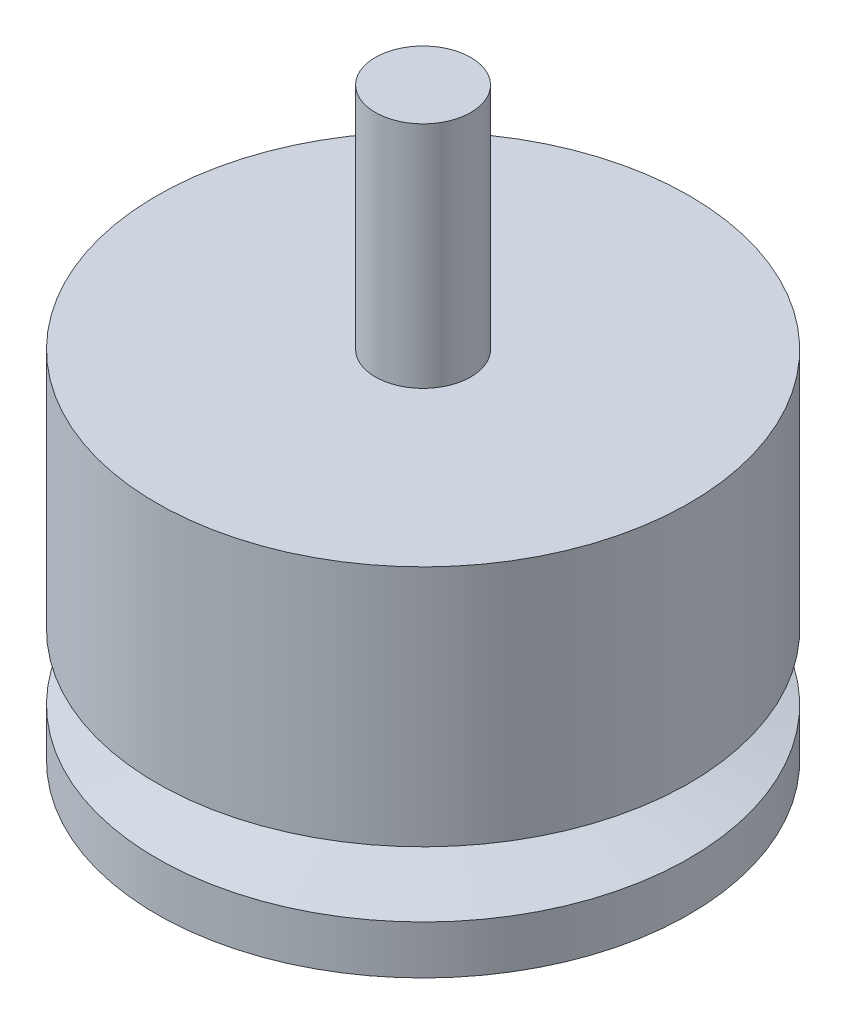
ISO-10303-21;
HEADER;
FILE_DESCRIPTION(('STEP AP214'),'2;1');
FILE_NAME('part.step','',(''),(''),'','','');
FILE_SCHEMA(('AUTOMOTIVE_DESIGN { 1 0 10303 214 1 1 1 1 }'));
ENDSEC;
DATA;
#1=APPLICATION_CONTEXT('core data for automotive mechanical design processes');
#2=APPLICATION_PROTOCOL_DEFINITION('international standard','automotive_design',2000,#1);
#3=PRODUCT_CONTEXT('',#1,'mechanical');
#4=PRODUCT('Part','Part','',(#3));
#5=PRODUCT_RELATED_PRODUCT_CATEGORY('part','',(#4));
#6=PRODUCT_DEFINITION_FORMATION('','',#4);
#7=PRODUCT_DEFINITION_CONTEXT('part definition',#1,'design');
#8=PRODUCT_DEFINITION('design','',#6,#7);
#9=PRODUCT_DEFINITION_SHAPE('','',#8);
#10=(LENGTH_UNIT() NAMED_UNIT(*) SI_UNIT(.MILLI.,.METRE.));
#11=(NAMED_UNIT(*) PLANE_ANGLE_UNIT() SI_UNIT($,.RADIAN.));
#12=(NAMED_UNIT(*) SI_UNIT($,.STERADIAN.) SOLID_ANGLE_UNIT());
#13=UNCERTAINTY_MEASURE_WITH_UNIT(LENGTH_MEASURE(1.E-05),#10,'distance_accuracy_value','');
#14=(GEOMETRIC_REPRESENTATION_CONTEXT(3) GLOBAL_UNCERTAINTY_ASSIGNED_CONTEXT((#13)) GLOBAL_UNIT_ASSIGNED_CONTEXT((#10,
#11,#12)) REPRESENTATION_CONTEXT('',''));
#15=CARTESIAN_POINT('',(0.,0.,0.));
#16=DIRECTION('',(0.,0.,1.));
#17=DIRECTION('',(1.,0.,0.));
#18=AXIS2_PLACEMENT_3D('',#15,#16,#17);
#19=CARTESIAN_POINT('',(0.,5.08,0.));
#20=DIRECTION('',(0.,-1.,0.));
#21=DIRECTION('',(0.,0.,-1.));
#22=AXIS2_PLACEMENT_3D('',#19,#20,#21);
#23=CONICAL_SURFACE('',#22,2.54,1.35175622013258);
#24=CARTESIAN_POINT('',(-4.34144925097724,4.16346794103388,5.04676434637863));
#25=CARTESIAN_POINT('',(-4.32426976424106,4.15971065275556,5.08380886528712));
#26=CARTESIAN_POINT('',(-4.30868173604316,4.15554026336153,5.12151715107546));
#27=CARTESIAN_POINT('',(-4.28075450487285,4.146424734595,5.19803810734475));
#28=CARTESIAN_POINT('',(-4.26841609279342,4.14147940708397,5.23685104413395));
#29=CARTESIAN_POINT('',(-4.23654732971852,4.12564167479924,5.3539898452163));
#30=CARTESIAN_POINT('',(-4.22190141063834,4.11368891519433,5.4335841536539));
#31=CARTESIAN_POINT('',(-4.210503152033,4.0949476810306,5.54825817179568));
#32=CARTESIAN_POINT('',(-4.20831535071958,4.08906284712664,5.58304831769235));
#33=CARTESIAN_POINT('',(-4.20644224427253,4.07690883523961,5.65266238890999));
#34=CARTESIAN_POINT('',(-4.20675907264512,4.07063933409837,5.68748631775886));
#35=CARTESIAN_POINT('',(-4.21208845887866,4.04878253064589,5.80544559781523));
#36=CARTESIAN_POINT('',(-4.22303219989646,4.03239149340086,5.88824305303923));
#37=CARTESIAN_POINT('',(-4.25885147952385,3.99831332378136,6.05058003421134));
#38=CARTESIAN_POINT('',(-4.2837507784772,3.98062402578263,6.13011375490007));
#39=CARTESIAN_POINT('',(-4.34665797081283,3.94458512507569,6.28355041302064));
#40=CARTESIAN_POINT('',(-4.3846503447226,3.92623632704598,6.35745989092124));
#41=CARTESIAN_POINT('',(-4.47263635373207,3.88942034838342,6.49767390222332));
#42=CARTESIAN_POINT('',(-4.52262564940027,3.87095321290008,6.56398117264911));
#43=CARTESIAN_POINT('',(-4.63371146187695,3.83423666766798,6.68770286388412));
#44=CARTESIAN_POINT('',(-4.69490012482606,3.81599051299367,6.74503558745141));
#45=CARTESIAN_POINT('',(-4.82639162060283,3.7803469977856,6.8484189898446));
#46=CARTESIAN_POINT('',(-4.89669506884008,3.76294969467362,6.89446890627375));
#47=CARTESIAN_POINT('',(-5.04407037282239,3.72950909303829,6.97365293675143));
#48=CARTESIAN_POINT('',(-5.12110742611017,3.7134595856533,7.00684914778159));
#49=CARTESIAN_POINT('',(-5.28004107507817,3.68299321854716,7.0595370022725));
#50=CARTESIAN_POINT('',(-5.36193726509146,3.66857622282661,7.07902978802818));
#51=CARTESIAN_POINT('',(-5.52686598441257,3.64191605655491,7.10338177636427));
#52=CARTESIAN_POINT('',(-5.60986004408261,3.62964210592738,7.10846759016453));
#53=CARTESIAN_POINT('',(-5.77578823736175,3.60726382535621,7.1043484729088));
#54=CARTESIAN_POINT('',(-5.85872237647832,3.59715926105659,7.09514508638166));
#55=CARTESIAN_POINT('',(-6.02045846930942,3.57951367429112,7.06289875681828));
#56=CARTESIAN_POINT('',(-6.09930922029668,3.57192708273291,7.04012540909384));
#57=CARTESIAN_POINT('',(-6.2522125597813,3.55921666669249,6.98152393007367));
#58=CARTESIAN_POINT('',(-6.3262656057504,3.55409260710252,6.94569704562567));
#59=CARTESIAN_POINT('',(-6.46623207993812,3.54647786475245,6.86264252781573));
#60=CARTESIAN_POINT('',(-6.53225586613385,3.54394675207711,6.81560448610062));
#61=CARTESIAN_POINT('',(-6.65557918162373,3.54142887683466,6.71116742799385));
#62=CARTESIAN_POINT('',(-6.71287921084729,3.54144196841274,6.65376900573335));
#63=CARTESIAN_POINT('',(-6.81669337921319,3.54400184168491,6.53075394631612));
#64=CARTESIAN_POINT('',(-6.86328828886317,3.54652882734257,6.46520502010281));
#65=CARTESIAN_POINT('',(-6.94497342630751,3.5540345645319,6.32742344007543));
#66=CARTESIAN_POINT('',(-6.98006372835495,3.55901330023894,6.25519082940306));
#67=CARTESIAN_POINT('',(-7.03788001020097,3.57133366331183,6.10594871727507));
#68=CARTESIAN_POINT('',(-7.0605791437513,3.57868036672928,6.02892924345028));
#69=CARTESIAN_POINT('',(-7.09296313218163,3.59558312298753,5.87243912262865));
#70=CARTESIAN_POINT('',(-7.10264738569214,3.605139277895,5.79296836254049));
#71=CARTESIAN_POINT('',(-7.10889245569804,3.62638768729009,5.63287546124948));
#72=CARTESIAN_POINT('',(-7.10530224429683,3.63810307470216,5.5522505303601));
#73=CARTESIAN_POINT('',(-7.0849020294038,3.66335290301942,5.39298536678026));
#74=CARTESIAN_POINT('',(-7.06809092284,3.67688749563001,5.31434530026003));
#75=CARTESIAN_POINT('',(-7.0214355821348,3.70574679616717,5.15981787018839));
#76=CARTESIAN_POINT('',(-6.99136721660325,3.72109881297568,5.08400329412288));
#77=CARTESIAN_POINT('',(-6.91911777660636,3.75305995992141,4.93867776935137));
#78=CARTESIAN_POINT('',(-6.87693597941415,3.76966916502304,4.86916719708851));
#79=CARTESIAN_POINT('',(-6.78081974676996,3.80408788099587,4.73707392981552));
#80=CARTESIAN_POINT('',(-6.72668219840849,3.82191392025262,4.67464330782159));
#81=CARTESIAN_POINT('',(-6.60867915144925,3.85805202774364,4.55990195769355));
#82=CARTESIAN_POINT('',(-6.54481027970831,3.87636426268215,4.5075947529412));
#83=CARTESIAN_POINT('',(-6.40822866801948,3.9132330723541,4.41391873310461));
#84=CARTESIAN_POINT('',(-6.33540824912185,3.93178961083807,4.37270699235297));
#85=CARTESIAN_POINT('',(-6.18371683190353,3.9683333836526,4.30339446749442));
#86=CARTESIAN_POINT('',(-6.10485344046682,3.98632129473244,4.27527750545937));
#87=CARTESIAN_POINT('',(-5.97487046642719,4.01432774597825,4.24124062661944));
#88=CARTESIAN_POINT('',(-5.92493602018613,4.02471656637307,4.23094037516632));
#89=CARTESIAN_POINT('',(-5.82415141658231,4.04492214003547,4.21563625022577));
#90=CARTESIAN_POINT('',(-5.77330134345734,4.05473894558004,4.21063189202195));
#91=CARTESIAN_POINT('',(-5.64218166309658,4.07903330116671,4.20471894484724));
#92=CARTESIAN_POINT('',(-5.56160232588523,4.0929921365325,4.20774959170019));
#93=CARTESIAN_POINT('',(-5.40162899790874,4.11857431743899,4.22721512282844));
#94=CARTESIAN_POINT('',(-5.32223647156198,4.1301949678559,4.24366536619097));
#95=CARTESIAN_POINT('',(-5.16963934808998,4.15018644858265,4.28892827994477));
#96=CARTESIAN_POINT('',(-5.09631546434338,4.15865665272383,4.31728886005179));
#97=CARTESIAN_POINT('',(-4.9903565529694,4.16902548424638,4.36851103063603));
#98=CARTESIAN_POINT('',(-4.95568630215314,4.17209361339385,4.38704722879703));
#99=CARTESIAN_POINT('',(-4.8879122454511,4.17741489638687,4.42690593606269));
#100=CARTESIAN_POINT('',(-4.85480873032697,4.17966789946926,4.44822895961813));
#101=CARTESIAN_POINT('',(-4.82259744500444,4.18149650036938,4.4708881520994));
#102=B_SPLINE_CURVE_WITH_KNOTS('',3,(#24,#25,#26,#27,#28,#29,#30,#31,#32,#33,#34,#35,#36,#37,
#38,#39,#40,#41,#42,#43,#44,#45,#46,#47,#48,#49,#50,#51,#52,#53,#54,#55,#56,#57,#58,#59,#60,#61,
#62,#63,#64,#65,#66,#67,#68,#69,#70,#71,#72,#73,#74,#75,#76,#77,#78,#79,#80,#81,#82,#83,#84,#85,
#86,#87,#88,#89,#90,#91,#92,#93,#94,#95,#96,#97,#98,#99,#100,#101),.UNSPECIFIED.,.F.,.F.,(4,2,2,
2,2,2,2,2,2,2,2,2,2,2,2,2,2,2,2,2,2,2,2,2,2,2,2,2,2,2,2,2,2,2,2,2,2,2,4),(0.,0.122924624040462,
0.24587913794067,0.489925568833832,0.595915035054,0.701994795474911,0.955977805269818,
1.21039455880623,1.46451077864839,1.71853521975514,1.97475223571576,2.23098655988476,
2.48596707889018,2.74092634061903,2.99185239347149,3.24275132545365,3.48882445820523,
3.73487409270262,3.97702601406881,4.21916405328853,4.45941031422098,4.69965502452473,
4.94041819494014,5.18119248974871,5.42471453719843,5.66825690481899,5.91608475197322,
6.16392738841893,6.41635817347627,6.66887665785835,6.92480154677935,7.18040940933288,
7.3362538105029,7.49208394649243,7.73639871685322,7.98099350497253,8.21704098239446,
8.33522239056465,8.45342564603822),.UNSPECIFIED.);
#103=CARTESIAN_POINT('',(-4.20837829885672,4.064,5.72331792701681));
#104=VERTEX_POINT('',#103);
#105=CARTESIAN_POINT('',(-5.72331792701681,4.064,4.20837829885671));
#106=VERTEX_POINT('',#105);
#107=EDGE_CURVE('E54',#104,#106,#102,.T.);
#108=ORIENTED_EDGE('',*,*,#107,.T.);
#109=CARTESIAN_POINT('',(-5.72463320064368,4.0638,4.20810602889861));
#110=CARTESIAN_POINT('',(-5.67091396494188,4.0719712011613,4.21920879720242));
#111=CARTESIAN_POINT('',(-5.61760548713363,4.07970024021288,4.23251687556384));
#112=CARTESIAN_POINT('',(-5.51213176417136,4.09417368181062,4.26353822122536));
#113=CARTESIAN_POINT('',(-5.45996689120646,4.10091776772867,4.28125290016863));
#114=CARTESIAN_POINT('',(-5.30574515096074,4.11951175536604,4.34097692099336));
#115=CARTESIAN_POINT('',(-5.20593670500022,4.12972715318229,4.38957124794735));
#116=CARTESIAN_POINT('',(-5.0170007590193,4.14494742214083,4.50257057876276));
#117=CARTESIAN_POINT('',(-4.92775637515097,4.15001520424922,4.5667725005784));
#118=CARTESIAN_POINT('',(-4.76151009614508,4.15477679900243,4.70948203658016));
#119=CARTESIAN_POINT('',(-4.6844946574369,4.15447659916918,4.78797361512712));
#120=CARTESIAN_POINT('',(-4.54838350221361,4.1486851843075,4.9527288140679));
#121=CARTESIAN_POINT('',(-4.48860788087488,4.14344244475002,5.03844258768537));
#122=CARTESIAN_POINT('',(-4.38369100003752,4.12847897392895,5.21807915748006));
#123=CARTESIAN_POINT('',(-4.33855040407604,4.11875803967694,5.31200232561781));
#124=CARTESIAN_POINT('',(-4.2812207815513,4.10090684056598,5.46005446270162));
#125=CARTESIAN_POINT('',(-4.2634886697279,4.09415427424935,5.51228043369682));
#126=CARTESIAN_POINT('',(-4.23248057151239,4.07967959270143,5.61774872427734));
#127=CARTESIAN_POINT('',(-4.21919235097371,4.07196022111054,5.67098781983983));
#128=CARTESIAN_POINT('',(-4.20810602889861,4.0638,5.72463320064368));
#129=B_SPLINE_CURVE_WITH_KNOTS('',3,(#109,#110,#111,#112,#113,#114,#115,#116,#117,#118,#119,
#120,#121,#122,#123,#124,#125,#126,#127,#128),.UNSPECIFIED.,.F.,.F.,(4,2,2,2,2,2,2,2,2,4),(0.,
0.166285332390803,0.332624002615493,0.665226579645517,0.993713529126705,1.32183410256196,
1.63429194627225,1.94676395452233,2.11329015985796,2.27935406593362),.UNSPECIFIED.);
#130=EDGE_CURVE('E11',#106,#104,#129,.T.);
#131=ORIENTED_EDGE('',*,*,#130,.T.);
#132=EDGE_LOOP('',(#108,#131));
#133=FACE_BOUND('',#132,.T.);
#134=CARTESIAN_POINT('',(5.04676434637863,4.16346794103388,4.34144925097724));
#135=CARTESIAN_POINT('',(5.08380886528712,4.15971065275556,4.32426976424106));
#136=CARTESIAN_POINT('',(5.12151715107546,4.15554026336153,4.30868173604316));
#137=CARTESIAN_POINT('',(5.19803810734474,4.146424734595,4.28075450487285));
#138=CARTESIAN_POINT('',(5.23685104413395,4.14147940708397,4.26841609279342));
#139=CARTESIAN_POINT('',(5.35398984521629,4.12564167479924,4.23654732971852));
#140=CARTESIAN_POINT('',(5.4335841536539,4.11368891519433,4.22190141063834));
#141=CARTESIAN_POINT('',(5.54825817179568,4.0949476810306,4.210503152033));
#142=CARTESIAN_POINT('',(5.58304831769235,4.08906284712664,4.20831535071958));
#143=CARTESIAN_POINT('',(5.65266238891,4.07690883523961,4.20644224427253));
#144=CARTESIAN_POINT('',(5.68748631775886,4.07063933409837,4.20675907264512));
#145=CARTESIAN_POINT('',(5.80544559781523,4.04878253064589,4.21208845887866));
#146=CARTESIAN_POINT('',(5.88824305303923,4.03239149340086,4.22303219989646));
#147=CARTESIAN_POINT('',(6.05058003421134,3.99831332378136,4.25885147952385));
#148=CARTESIAN_POINT('',(6.13011375490007,3.98062402578263,4.2837507784772));
#149=CARTESIAN_POINT('',(6.28355041302064,3.94458512507569,4.34665797081283));
#150=CARTESIAN_POINT('',(6.35745989092124,3.92623632704598,4.3846503447226));
#151=CARTESIAN_POINT('',(6.49767390222332,3.88942034838342,4.47263635373207));
#152=CARTESIAN_POINT('',(6.56398117264911,3.87095321290008,4.52262564940027));
#153=CARTESIAN_POINT('',(6.68770286388412,3.83423666766798,4.63371146187695));
#154=CARTESIAN_POINT('',(6.74503558745141,3.81599051299367,4.69490012482606));
#155=CARTESIAN_POINT('',(6.8484189898446,3.7803469977856,4.82639162060283));
#156=CARTESIAN_POINT('',(6.89446890627375,3.76294969467362,4.89669506884008));
#157=CARTESIAN_POINT('',(6.97365293675143,3.72950909303829,5.04407037282239));
#158=CARTESIAN_POINT('',(7.00684914778159,3.7134595856533,5.12110742611017));
#159=CARTESIAN_POINT('',(7.0595370022725,3.68299321854716,5.28004107507817));
#160=CARTESIAN_POINT('',(7.07902978802818,3.66857622282661,5.36193726509146));
#161=CARTESIAN_POINT('',(7.10338177636427,3.64191605655491,5.52686598441257));
#162=CARTESIAN_POINT('',(7.10846759016453,3.62964210592738,5.60986004408261));
#163=CARTESIAN_POINT('',(7.1043484729088,3.60726382535621,5.77578823736175));
#164=CARTESIAN_POINT('',(7.09514508638166,3.59715926105659,5.85872237647832));
#165=CARTESIAN_POINT('',(7.06289875681828,3.57951367429112,6.02045846930942));
#166=CARTESIAN_POINT('',(7.04012540909384,3.57192708273291,6.09930922029668));
#167=CARTESIAN_POINT('',(6.98152393007367,3.55921666669249,6.2522125597813));
#168=CARTESIAN_POINT('',(6.94569704562567,3.55409260710252,6.3262656057504));
#169=CARTESIAN_POINT('',(6.86264252781573,3.54647786475245,6.46623207993812));
#170=CARTESIAN_POINT('',(6.81560448610062,3.54394675207711,6.53225586613385));
#171=CARTESIAN_POINT('',(6.71116742799385,3.54142887683466,6.65557918162373));
#172=CARTESIAN_POINT('',(6.65376900573335,3.54144196841274,6.71287921084729));
#173=CARTESIAN_POINT('',(6.53075394631612,3.54400184168491,6.81669337921319));
#174=CARTESIAN_POINT('',(6.46520502010281,3.54652882734257,6.86328828886317));
#175=CARTESIAN_POINT('',(6.32742344007543,3.5540345645319,6.94497342630751));
#176=CARTESIAN_POINT('',(6.25519082940306,3.55901330023894,6.98006372835495));
#177=CARTESIAN_POINT('',(6.10594871727507,3.57133366331183,7.03788001020097));
#178=CARTESIAN_POINT('',(6.02892924345028,3.57868036672928,7.0605791437513));
#179=CARTESIAN_POINT('',(5.87243912262865,3.59558312298753,7.09296313218163));
#180=CARTESIAN_POINT('',(5.79296836254049,3.605139277895,7.10264738569214));
#181=CARTESIAN_POINT('',(5.63287546124948,3.62638768729009,7.10889245569804));
#182=CARTESIAN_POINT('',(5.5522505303601,3.63810307470216,7.10530224429683));
#183=CARTESIAN_POINT('',(5.39298536678026,3.66335290301942,7.0849020294038));
#184=CARTESIAN_POINT('',(5.31434530026003,3.67688749563001,7.06809092284));
#185=CARTESIAN_POINT('',(5.15981787018839,3.70574679616717,7.0214355821348));
#186=CARTESIAN_POINT('',(5.08400329412288,3.72109881297568,6.99136721660325));
#187=CARTESIAN_POINT('',(4.93867776935137,3.75305995992141,6.91911777660636));
#188=CARTESIAN_POINT('',(4.86916719708851,3.76966916502304,6.87693597941415));
#189=CARTESIAN_POINT('',(4.73707392981552,3.80408788099587,6.78081974676996));
#190=CARTESIAN_POINT('',(4.67464330782159,3.82191392025262,6.72668219840849));
#191=CARTESIAN_POINT('',(4.55990195769355,3.85805202774364,6.60867915144925));
#192=CARTESIAN_POINT('',(4.5075947529412,3.87636426268215,6.54481027970831));
#193=CARTESIAN_POINT('',(4.41391873310461,3.9132330723541,6.40822866801948));
#194=CARTESIAN_POINT('',(4.37270699235297,3.93178961083807,6.33540824912185));
#195=CARTESIAN_POINT('',(4.30339446749442,3.96833338365261,6.18371683190353));
#196=CARTESIAN_POINT('',(4.27527750545937,3.98632129473244,6.10485344046681));
#197=CARTESIAN_POINT('',(4.24124062661944,4.01432774597825,5.97487046642719));
#198=CARTESIAN_POINT('',(4.23094037516632,4.02471656637307,5.92493602018613));
#199=CARTESIAN_POINT('',(4.21563625022577,4.04492214003547,5.82415141658232));
#200=CARTESIAN_POINT('',(4.21063189202195,4.05473894558004,5.77330134345734));
#201=CARTESIAN_POINT('',(4.20471894484725,4.07903330116671,5.64218166309658));
#202=CARTESIAN_POINT('',(4.20774959170019,4.0929921365325,5.56160232588523));
#203=CARTESIAN_POINT('',(4.22721512282844,4.11857431743899,5.40162899790874));
#204=CARTESIAN_POINT('',(4.24366536619097,4.1301949678559,5.32223647156198));
#205=CARTESIAN_POINT('',(4.28892827994477,4.15018644858265,5.16963934808999));
#206=CARTESIAN_POINT('',(4.31728886005179,4.15865665272382,5.09631546434338));
#207=CARTESIAN_POINT('',(4.36851103063603,4.16902548424638,4.9903565529694));
#208=CARTESIAN_POINT('',(4.38704722879702,4.17209361339385,4.95568630215314));
#209=CARTESIAN_POINT('',(4.42690593606269,4.17741489638687,4.8879122454511));
#210=CARTESIAN_POINT('',(4.44822895961813,4.17966789946926,4.85480873032697));
#211=CARTESIAN_POINT('',(4.4708881520994,4.18149650036938,4.82259744500444));
#212=B_SPLINE_CURVE_WITH_KNOTS('',3,(#134,#135,#136,#137,#138,#139,#140,#141,#142,#143,#144,
#145,#146,#147,#148,#149,#150,#151,#152,#153,#154,#155,#156,#157,#158,#159,#160,#161,#162,#163,
#164,#165,#166,#167,#168,#169,#170,#171,#172,#173,#174,#175,#176,#177,#178,#179,#180,#181,#182,
#183,#184,#185,#186,#187,#188,#189,#190,#191,#192,#193,#194,#195,#196,#197,#198,#199,#200,#201,
#202,#203,#204,#205,#206,#207,#208,#209,#210,#211),.UNSPECIFIED.,.F.,.F.,(4,2,2,2,2,2,2,2,2,2,2,
2,2,2,2,2,2,2,2,2,2,2,2,2,2,2,2,2,2,2,2,2,2,2,2,2,2,2,4),(0.,0.122924624040461,
0.245879137940669,0.489925568833832,0.595915035054002,0.701994795474912,0.955977805269819,
1.21039455880624,1.46451077864839,1.71853521975514,1.97475223571576,2.23098655988476,
2.48596707889018,2.74092634061903,2.99185239347149,3.24275132545365,3.48882445820523,
3.73487409270262,3.97702601406881,4.21916405328853,4.45941031422098,4.69965502452473,
4.94041819494014,5.18119248974871,5.42471453719843,5.668256904819,5.91608475197323,
6.16392738841893,6.41635817347627,6.66887665785835,6.92480154677936,7.18040940933288,
7.3362538105029,7.49208394649242,7.73639871685322,7.98099350497253,8.21704098239446,
8.33522239056465,8.45342564603822),.UNSPECIFIED.);
#213=CARTESIAN_POINT('',(5.72331792701681,4.064,4.20837829885672));
#214=VERTEX_POINT('',#213);
#215=CARTESIAN_POINT('',(4.20837829885671,4.064,5.72331792701681));
#216=VERTEX_POINT('',#215);
#217=EDGE_CURVE('E99',#214,#216,#212,.T.);
#218=ORIENTED_EDGE('',*,*,#217,.T.);
#219=CARTESIAN_POINT('',(4.20810602889861,4.0638,5.72463320064368));
#220=CARTESIAN_POINT('',(4.21920879720242,4.0719712011613,5.67091396494188));
#221=CARTESIAN_POINT('',(4.23251687556384,4.07970024021288,5.61760548713363));
#222=CARTESIAN_POINT('',(4.26353822122536,4.09417368181062,5.51213176417136));
#223=CARTESIAN_POINT('',(4.28125290016863,4.10091776772867,5.45996689120646));
#224=CARTESIAN_POINT('',(4.34097692099337,4.11951175536605,5.30574515096073));
#225=CARTESIAN_POINT('',(4.38957124794735,4.12972715318229,5.20593670500021));
#226=CARTESIAN_POINT('',(4.50257057876276,4.14494742214083,5.01700075901929));
#227=CARTESIAN_POINT('',(4.5667725005784,4.15001520424922,4.92775637515097));
#228=CARTESIAN_POINT('',(4.70948203658016,4.15477679900243,4.76151009614508));
#229=CARTESIAN_POINT('',(4.78797361512712,4.15447659916918,4.6844946574369));
#230=CARTESIAN_POINT('',(4.9527288140679,4.1486851843075,4.54838350221361));
#231=CARTESIAN_POINT('',(5.03844258768537,4.14344244475002,4.48860788087488));
#232=CARTESIAN_POINT('',(5.21807915748006,4.12847897392895,4.38369100003752));
#233=CARTESIAN_POINT('',(5.31200232561781,4.11875803967694,4.33855040407604));
#234=CARTESIAN_POINT('',(5.46005446270162,4.10090684056598,4.2812207815513));
#235=CARTESIAN_POINT('',(5.51228043369683,4.09415427424934,4.2634886697279));
#236=CARTESIAN_POINT('',(5.61774872427734,4.07967959270143,4.23248057151239));
#237=CARTESIAN_POINT('',(5.67098781983983,4.07196022111054,4.21919235097371));
#238=CARTESIAN_POINT('',(5.72463320064368,4.0638,4.20810602889861));
#239=B_SPLINE_CURVE_WITH_KNOTS('',3,(#219,#220,#221,#222,#223,#224,#225,#226,#227,#228,#229,
#230,#231,#232,#233,#234,#235,#236,#237,#238),.UNSPECIFIED.,.F.,.F.,(4,2,2,2,2,2,2,2,2,4),(0.,
0.166285332390804,0.332624002615494,0.665226579645518,0.993713529126705,1.32183410256196,
1.63429194627225,1.94676395452233,2.11329015985796,2.27935406593362),.UNSPECIFIED.);
#240=EDGE_CURVE('E87',#216,#214,#239,.T.);
#241=ORIENTED_EDGE('',*,*,#240,.T.);
#242=EDGE_LOOP('',(#218,#241));
#243=FACE_BOUND('',#242,.T.);
#244=CARTESIAN_POINT('',(4.34144925097724,4.16346794103388,-5.04676434637863));
#245=CARTESIAN_POINT('',(4.32426976424106,4.15971065275556,-5.08380886528712));
#246=CARTESIAN_POINT('',(4.30868173604316,4.15554026336153,-5.12151715107546));
#247=CARTESIAN_POINT('',(4.28075450487285,4.146424734595,-5.19803810734475));
#248=CARTESIAN_POINT('',(4.26841609279342,4.14147940708397,-5.23685104413395));
#249=CARTESIAN_POINT('',(4.23654732971852,4.12564167479924,-5.3539898452163));
#250=CARTESIAN_POINT('',(4.22190141063834,4.11368891519433,-5.4335841536539));
#251=CARTESIAN_POINT('',(4.210503152033,4.0949476810306,-5.54825817179568));
#252=CARTESIAN_POINT('',(4.20831535071958,4.08906284712664,-5.58304831769235));
#253=CARTESIAN_POINT('',(4.20644224427253,4.07690883523961,-5.65266238890999));
#254=CARTESIAN_POINT('',(4.20675907264512,4.07063933409837,-5.68748631775886));
#255=CARTESIAN_POINT('',(4.21208845887866,4.04878253064589,-5.80544559781523));
#256=CARTESIAN_POINT('',(4.22303219989646,4.03239149340086,-5.88824305303922));
#257=CARTESIAN_POINT('',(4.25885147952385,3.99831332378136,-6.05058003421134));
#258=CARTESIAN_POINT('',(4.2837507784772,3.98062402578263,-6.13011375490006));
#259=CARTESIAN_POINT('',(4.34665797081283,3.94458512507569,-6.28355041302064));
#260=CARTESIAN_POINT('',(4.3846503447226,3.92623632704599,-6.35745989092123));
#261=CARTESIAN_POINT('',(4.47263635373207,3.88942034838342,-6.49767390222332));
#262=CARTESIAN_POINT('',(4.52262564940026,3.87095321290008,-6.56398117264911));
#263=CARTESIAN_POINT('',(4.63371146187695,3.83423666766798,-6.68770286388411));
#264=CARTESIAN_POINT('',(4.69490012482606,3.81599051299368,-6.74503558745141));
#265=CARTESIAN_POINT('',(4.82639162060283,3.7803469977856,-6.8484189898446));
#266=CARTESIAN_POINT('',(4.89669506884008,3.76294969467362,-6.89446890627375));
#267=CARTESIAN_POINT('',(5.04407037282238,3.72950909303829,-6.97365293675143));
#268=CARTESIAN_POINT('',(5.12110742611017,3.7134595856533,-7.00684914778158));
#269=CARTESIAN_POINT('',(5.28004107507816,3.68299321854716,-7.0595370022725));
#270=CARTESIAN_POINT('',(5.36193726509146,3.66857622282661,-7.07902978802818));
#271=CARTESIAN_POINT('',(5.52686598441257,3.64191605655491,-7.10338177636427));
#272=CARTESIAN_POINT('',(5.60986004408261,3.62964210592738,-7.10846759016453));
#273=CARTESIAN_POINT('',(5.77578823736175,3.60726382535621,-7.1043484729088));
#274=CARTESIAN_POINT('',(5.85872237647832,3.59715926105659,-7.09514508638166));
#275=CARTESIAN_POINT('',(6.02045846930942,3.57951367429112,-7.06289875681828));
#276=CARTESIAN_POINT('',(6.09930922029668,3.57192708273291,-7.04012540909384));
#277=CARTESIAN_POINT('',(6.25221255978129,3.55921666669249,-6.98152393007367));
#278=CARTESIAN_POINT('',(6.3262656057504,3.55409260710252,-6.94569704562567));
#279=CARTESIAN_POINT('',(6.46623207993811,3.54647786475245,-6.86264252781573));
#280=CARTESIAN_POINT('',(6.53225586613385,3.54394675207711,-6.81560448610063));
#281=CARTESIAN_POINT('',(6.65557918162373,3.54142887683466,-6.71116742799385));
#282=CARTESIAN_POINT('',(6.71287921084729,3.54144196841274,-6.65376900573335));
#283=CARTESIAN_POINT('',(6.81669337921318,3.54400184168491,-6.53075394631612));
#284=CARTESIAN_POINT('',(6.86328828886316,3.54652882734257,-6.46520502010282));
#285=CARTESIAN_POINT('',(6.94497342630751,3.5540345645319,-6.32742344007543));
#286=CARTESIAN_POINT('',(6.98006372835495,3.55901330023894,-6.25519082940306));
#287=CARTESIAN_POINT('',(7.03788001020097,3.57133366331183,-6.10594871727507));
#288=CARTESIAN_POINT('',(7.0605791437513,3.57868036672928,-6.02892924345028));
#289=CARTESIAN_POINT('',(7.09296313218163,3.59558312298753,-5.87243912262866));
#290=CARTESIAN_POINT('',(7.10264738569214,3.605139277895,-5.79296836254049));
#291=CARTESIAN_POINT('',(7.10889245569804,3.62638768729009,-5.63287546124948));
#292=CARTESIAN_POINT('',(7.10530224429683,3.63810307470216,-5.5522505303601));
#293=CARTESIAN_POINT('',(7.0849020294038,3.66335290301942,-5.39298536678027));
#294=CARTESIAN_POINT('',(7.06809092284,3.67688749563001,-5.31434530026003));
#295=CARTESIAN_POINT('',(7.0214355821348,3.70574679616717,-5.15981787018839));
#296=CARTESIAN_POINT('',(6.99136721660325,3.72109881297568,-5.08400329412289));
#297=CARTESIAN_POINT('',(6.91911777660636,3.75305995992141,-4.93867776935138));
#298=CARTESIAN_POINT('',(6.87693597941415,3.76966916502303,-4.86916719708851));
#299=CARTESIAN_POINT('',(6.78081974676996,3.80408788099586,-4.73707392981552));
#300=CARTESIAN_POINT('',(6.72668219840849,3.82191392025261,-4.67464330782159));
#301=CARTESIAN_POINT('',(6.60867915144925,3.85805202774364,-4.55990195769356));
#302=CARTESIAN_POINT('',(6.54481027970831,3.87636426268215,-4.5075947529412));
#303=CARTESIAN_POINT('',(6.40822866801948,3.9132330723541,-4.41391873310461));
#304=CARTESIAN_POINT('',(6.33540824912186,3.93178961083807,-4.37270699235297));
#305=CARTESIAN_POINT('',(6.18371683190354,3.9683333836526,-4.30339446749442));
#306=CARTESIAN_POINT('',(6.10485344046682,3.98632129473244,-4.27527750545937));
#307=CARTESIAN_POINT('',(5.97487046642719,4.01432774597825,-4.24124062661944));
#308=CARTESIAN_POINT('',(5.92493602018614,4.02471656637307,-4.23094037516632));
#309=CARTESIAN_POINT('',(5.82415141658232,4.04492214003547,-4.21563625022577));
#310=CARTESIAN_POINT('',(5.77330134345734,4.05473894558004,-4.21063189202195));
#311=CARTESIAN_POINT('',(5.64218166309658,4.07903330116671,-4.20471894484724));
#312=CARTESIAN_POINT('',(5.56160232588523,4.0929921365325,-4.20774959170019));
#313=CARTESIAN_POINT('',(5.40162899790874,4.11857431743899,-4.22721512282844));
#314=CARTESIAN_POINT('',(5.32223647156198,4.1301949678559,-4.24366536619097));
#315=CARTESIAN_POINT('',(5.16963934808999,4.15018644858265,-4.28892827994477));
#316=CARTESIAN_POINT('',(5.09631546434338,4.15865665272382,-4.31728886005179));
#317=CARTESIAN_POINT('',(4.9903565529694,4.16902548424638,-4.36851103063603));
#318=CARTESIAN_POINT('',(4.95568630215314,4.17209361339385,-4.38704722879702));
#319=CARTESIAN_POINT('',(4.8879122454511,4.17741489638687,-4.42690593606269));
#320=CARTESIAN_POINT('',(4.85480873032697,4.17966789946926,-4.44822895961813));
#321=CARTESIAN_POINT('',(4.82259744500444,4.18149650036938,-4.4708881520994));
#322=B_SPLINE_CURVE_WITH_KNOTS('',3,(#244,#245,#246,#247,#248,#249,#250,#251,#252,#253,#254,
#255,#256,#257,#258,#259,#260,#261,#262,#263,#264,#265,#266,#267,#268,#269,#270,#271,#272,#273,
#274,#275,#276,#277,#278,#279,#280,#281,#282,#283,#284,#285,#286,#287,#288,#289,#290,#291,#292,
#293,#294,#295,#296,#297,#298,#299,#300,#301,#302,#303,#304,#305,#306,#307,#308,#309,#310,#311,
#312,#313,#314,#315,#316,#317,#318,#319,#320,#321),.UNSPECIFIED.,.F.,.F.,(4,2,2,2,2,2,2,2,2,2,2,
2,2,2,2,2,2,2,2,2,2,2,2,2,2,2,2,2,2,2,2,2,2,2,2,2,2,2,4),(0.,0.122924624040462,0.24587913794067,
0.489925568833832,0.595915035053999,0.701994795474907,0.955977805269816,1.21039455880623,
1.46451077864838,1.71853521975514,1.97475223571576,2.23098655988476,2.48596707889017,
2.74092634061903,2.99185239347148,3.24275132545365,3.48882445820523,3.73487409270261,
3.9770260140688,4.21916405328853,4.45941031422097,4.69965502452472,4.94041819494013,
5.18119248974871,5.42471453719842,5.66825690481899,5.91608475197322,6.16392738841892,
6.41635817347627,6.66887665785835,6.92480154677935,7.18040940933288,7.3362538105029,
7.49208394649242,7.73639871685321,7.98099350497253,8.21704098239446,8.33522239056465,
8.45342564603822),.UNSPECIFIED.);
#323=CARTESIAN_POINT('',(4.20837829885672,4.064,-5.72331792701681));
#324=VERTEX_POINT('',#323);
#325=CARTESIAN_POINT('',(5.72331792701681,4.064,-4.20837829885671));
#326=VERTEX_POINT('',#325);
#327=EDGE_CURVE('E103',#324,#326,#322,.T.);
#328=ORIENTED_EDGE('',*,*,#327,.T.);
#329=CARTESIAN_POINT('',(5.72463320064368,4.0638,-4.20810602889861));
#330=CARTESIAN_POINT('',(5.67091396494188,4.0719712011613,-4.21920879720242));
#331=CARTESIAN_POINT('',(5.61760548713363,4.07970024021288,-4.23251687556384));
#332=CARTESIAN_POINT('',(5.51213176417136,4.09417368181062,-4.26353822122536));
#333=CARTESIAN_POINT('',(5.45996689120646,4.10091776772867,-4.28125290016863));
#334=CARTESIAN_POINT('',(5.30574515096073,4.11951175536605,-4.34097692099337));
#335=CARTESIAN_POINT('',(5.20593670500021,4.12972715318229,-4.38957124794735));
#336=CARTESIAN_POINT('',(5.01700075901929,4.14494742214083,-4.50257057876276));
#337=CARTESIAN_POINT('',(4.92775637515097,4.15001520424922,-4.5667725005784));
#338=CARTESIAN_POINT('',(4.76151009614508,4.15477679900243,-4.70948203658016));
#339=CARTESIAN_POINT('',(4.6844946574369,4.15447659916918,-4.78797361512712));
#340=CARTESIAN_POINT('',(4.54838350221361,4.1486851843075,-4.9527288140679));
#341=CARTESIAN_POINT('',(4.48860788087488,4.14344244475002,-5.03844258768537));
#342=CARTESIAN_POINT('',(4.38369100003752,4.12847897392895,-5.21807915748006));
#343=CARTESIAN_POINT('',(4.33855040407603,4.11875803967694,-5.31200232561781));
#344=CARTESIAN_POINT('',(4.2812207815513,4.10090684056598,-5.46005446270162));
#345=CARTESIAN_POINT('',(4.2634886697279,4.09415427424934,-5.51228043369683));
#346=CARTESIAN_POINT('',(4.23248057151239,4.07967959270143,-5.61774872427734));
#347=CARTESIAN_POINT('',(4.21919235097371,4.07196022111054,-5.67098781983983));
#348=CARTESIAN_POINT('',(4.20810602889861,4.0638,-5.72463320064369));
#349=B_SPLINE_CURVE_WITH_KNOTS('',3,(#329,#330,#331,#332,#333,#334,#335,#336,#337,#338,#339,
#340,#341,#342,#343,#344,#345,#346,#347,#348),.UNSPECIFIED.,.F.,.F.,(4,2,2,2,2,2,2,2,2,4),(0.,
0.166285332390804,0.332624002615494,0.665226579645518,0.993713529126705,1.32183410256196,
1.63429194627225,1.94676395452233,2.11329015985796,2.27935406593362),.UNSPECIFIED.);
#350=EDGE_CURVE('E225',#326,#324,#349,.T.);
#351=ORIENTED_EDGE('',*,*,#350,.T.);
#352=EDGE_LOOP('',(#328,#351));
#353=FACE_BOUND('',#352,.T.);
#354=CARTESIAN_POINT('',(-5.04676434637863,4.16346794103388,-4.34144925097724));
#355=CARTESIAN_POINT('',(-5.08380886528712,4.15971065275556,-4.32426976424106));
#356=CARTESIAN_POINT('',(-5.12151715107546,4.15554026336153,-4.30868173604316));
#357=CARTESIAN_POINT('',(-5.19803810734474,4.146424734595,-4.28075450487285));
#358=CARTESIAN_POINT('',(-5.23685104413395,4.14147940708397,-4.26841609279342));
#359=CARTESIAN_POINT('',(-5.35398984521629,4.12564167479924,-4.23654732971852));
#360=CARTESIAN_POINT('',(-5.4335841536539,4.11368891519433,-4.22190141063834));
#361=CARTESIAN_POINT('',(-5.54825817179568,4.0949476810306,-4.210503152033));
#362=CARTESIAN_POINT('',(-5.58304831769235,4.08906284712664,-4.20831535071958));
#363=CARTESIAN_POINT('',(-5.65266238890999,4.07690883523961,-4.20644224427253));
#364=CARTESIAN_POINT('',(-5.68748631775886,4.07063933409837,-4.20675907264512));
#365=CARTESIAN_POINT('',(-5.80544559781523,4.04878253064589,-4.21208845887866));
#366=CARTESIAN_POINT('',(-5.88824305303922,4.03239149340086,-4.22303219989646));
#367=CARTESIAN_POINT('',(-6.05058003421134,3.99831332378136,-4.25885147952385));
#368=CARTESIAN_POINT('',(-6.13011375490006,3.98062402578263,-4.2837507784772));
#369=CARTESIAN_POINT('',(-6.28355041302064,3.94458512507569,-4.34665797081283));
#370=CARTESIAN_POINT('',(-6.35745989092123,3.92623632704599,-4.3846503447226));
#371=CARTESIAN_POINT('',(-6.49767390222332,3.88942034838342,-4.47263635373207));
#372=CARTESIAN_POINT('',(-6.56398117264911,3.87095321290008,-4.52262564940026));
#373=CARTESIAN_POINT('',(-6.68770286388411,3.83423666766798,-4.63371146187695));
#374=CARTESIAN_POINT('',(-6.74503558745141,3.81599051299368,-4.69490012482606));
#375=CARTESIAN_POINT('',(-6.8484189898446,3.7803469977856,-4.82639162060283));
#376=CARTESIAN_POINT('',(-6.89446890627375,3.76294969467362,-4.89669506884008));
#377=CARTESIAN_POINT('',(-6.97365293675143,3.72950909303829,-5.04407037282238));
#378=CARTESIAN_POINT('',(-7.00684914778158,3.7134595856533,-5.12110742611017));
#379=CARTESIAN_POINT('',(-7.0595370022725,3.68299321854716,-5.28004107507816));
#380=CARTESIAN_POINT('',(-7.07902978802818,3.66857622282661,-5.36193726509146));
#381=CARTESIAN_POINT('',(-7.10338177636427,3.64191605655491,-5.52686598441257));
#382=CARTESIAN_POINT('',(-7.10846759016453,3.62964210592738,-5.60986004408261));
#383=CARTESIAN_POINT('',(-7.1043484729088,3.60726382535621,-5.77578823736175));
#384=CARTESIAN_POINT('',(-7.09514508638166,3.59715926105659,-5.85872237647832));
#385=CARTESIAN_POINT('',(-7.06289875681828,3.57951367429112,-6.02045846930942));
#386=CARTESIAN_POINT('',(-7.04012540909384,3.57192708273291,-6.09930922029668));
#387=CARTESIAN_POINT('',(-6.98152393007367,3.55921666669249,-6.25221255978129));
#388=CARTESIAN_POINT('',(-6.94569704562567,3.55409260710252,-6.3262656057504));
#389=CARTESIAN_POINT('',(-6.86264252781573,3.54647786475245,-6.46623207993811));
#390=CARTESIAN_POINT('',(-6.81560448610063,3.54394675207711,-6.53225586613385));
#391=CARTESIAN_POINT('',(-6.71116742799385,3.54142887683466,-6.65557918162373));
#392=CARTESIAN_POINT('',(-6.65376900573335,3.54144196841274,-6.71287921084729));
#393=CARTESIAN_POINT('',(-6.53075394631612,3.54400184168491,-6.81669337921318));
#394=CARTESIAN_POINT('',(-6.46520502010282,3.54652882734257,-6.86328828886316));
#395=CARTESIAN_POINT('',(-6.32742344007543,3.5540345645319,-6.94497342630751));
#396=CARTESIAN_POINT('',(-6.25519082940306,3.55901330023894,-6.98006372835495));
#397=CARTESIAN_POINT('',(-6.10594871727507,3.57133366331183,-7.03788001020097));
#398=CARTESIAN_POINT('',(-6.02892924345028,3.57868036672928,-7.0605791437513));
#399=CARTESIAN_POINT('',(-5.87243912262866,3.59558312298753,-7.09296313218163));
#400=CARTESIAN_POINT('',(-5.79296836254049,3.605139277895,-7.10264738569214));
#401=CARTESIAN_POINT('',(-5.63287546124948,3.62638768729009,-7.10889245569804));
#402=CARTESIAN_POINT('',(-5.5522505303601,3.63810307470216,-7.10530224429683));
#403=CARTESIAN_POINT('',(-5.39298536678027,3.66335290301942,-7.0849020294038));
#404=CARTESIAN_POINT('',(-5.31434530026003,3.67688749563001,-7.06809092284));
#405=CARTESIAN_POINT('',(-5.15981787018839,3.70574679616717,-7.0214355821348));
#406=CARTESIAN_POINT('',(-5.08400329412289,3.72109881297568,-6.99136721660325));
#407=CARTESIAN_POINT('',(-4.93867776935138,3.75305995992141,-6.91911777660636));
#408=CARTESIAN_POINT('',(-4.86916719708851,3.76966916502303,-6.87693597941415));
#409=CARTESIAN_POINT('',(-4.73707392981552,3.80408788099586,-6.78081974676996));
#410=CARTESIAN_POINT('',(-4.67464330782159,3.82191392025261,-6.72668219840849));
#411=CARTESIAN_POINT('',(-4.55990195769356,3.85805202774364,-6.60867915144925));
#412=CARTESIAN_POINT('',(-4.5075947529412,3.87636426268215,-6.54481027970831));
#413=CARTESIAN_POINT('',(-4.41391873310461,3.9132330723541,-6.40822866801948));
#414=CARTESIAN_POINT('',(-4.37270699235297,3.93178961083807,-6.33540824912186));
#415=CARTESIAN_POINT('',(-4.30339446749442,3.9683333836526,-6.18371683190354));
#416=CARTESIAN_POINT('',(-4.27527750545937,3.98632129473244,-6.10485344046682));
#417=CARTESIAN_POINT('',(-4.24124062661944,4.01432774597825,-5.97487046642719));
#418=CARTESIAN_POINT('',(-4.23094037516632,4.02471656637307,-5.92493602018613));
#419=CARTESIAN_POINT('',(-4.21563625022577,4.04492214003547,-5.82415141658231));
#420=CARTESIAN_POINT('',(-4.21063189202195,4.05473894558004,-5.77330134345734));
#421=CARTESIAN_POINT('',(-4.20471894484724,4.07903330116671,-5.64218166309658));
#422=CARTESIAN_POINT('',(-4.20774959170019,4.0929921365325,-5.56160232588523));
#423=CARTESIAN_POINT('',(-4.22721512282844,4.11857431743899,-5.40162899790874));
#424=CARTESIAN_POINT('',(-4.24366536619097,4.1301949678559,-5.32223647156198));
#425=CARTESIAN_POINT('',(-4.28892827994477,4.15018644858265,-5.16963934808998));
#426=CARTESIAN_POINT('',(-4.31728886005179,4.15865665272383,-5.09631546434338));
#427=CARTESIAN_POINT('',(-4.36851103063603,4.16902548424638,-4.9903565529694));
#428=CARTESIAN_POINT('',(-4.38704722879703,4.17209361339385,-4.95568630215314));
#429=CARTESIAN_POINT('',(-4.42690593606269,4.17741489638687,-4.8879122454511));
#430=CARTESIAN_POINT('',(-4.44822895961813,4.17966789946926,-4.85480873032697));
#431=CARTESIAN_POINT('',(-4.4708881520994,4.18149650036938,-4.82259744500444));
#432=B_SPLINE_CURVE_WITH_KNOTS('',3,(#354,#355,#356,#357,#358,#359,#360,#361,#362,#363,#364,
#365,#366,#367,#368,#369,#370,#371,#372,#373,#374,#375,#376,#377,#378,#379,#380,#381,#382,#383,
#384,#385,#386,#387,#388,#389,#390,#391,#392,#393,#394,#395,#396,#397,#398,#399,#400,#401,#402,
#403,#404,#405,#406,#407,#408,#409,#410,#411,#412,#413,#414,#415,#416,#417,#418,#419,#420,#421,
#422,#423,#424,#425,#426,#427,#428,#429,#430,#431),.UNSPECIFIED.,.F.,.F.,(4,2,2,2,2,2,2,2,2,2,2,
2,2,2,2,2,2,2,2,2,2,2,2,2,2,2,2,2,2,2,2,2,2,2,2,2,2,2,4),(0.,0.122924624040461,
0.245879137940669,0.489925568833832,0.595915035053999,0.701994795474908,0.955977805269817,
1.21039455880623,1.46451077864838,1.71853521975514,1.97475223571576,2.23098655988476,
2.48596707889017,2.74092634061903,2.99185239347148,3.24275132545365,3.48882445820523,
3.73487409270262,3.9770260140688,4.21916405328853,4.45941031422097,4.69965502452473,
4.94041819494014,5.18119248974871,5.42471453719842,5.66825690481899,5.91608475197322,
6.16392738841893,6.41635817347627,6.66887665785835,6.92480154677935,7.18040940933288,
7.3362538105029,7.49208394649243,7.73639871685322,7.98099350497253,8.21704098239446,
8.33522239056465,8.45342564603823),.UNSPECIFIED.);
#433=CARTESIAN_POINT('',(-5.72331792701681,4.064,-4.20837829885672));
#434=VERTEX_POINT('',#433);
#435=CARTESIAN_POINT('',(-4.20837829885671,4.064,-5.72331792701681));
#436=VERTEX_POINT('',#435);
#437=EDGE_CURVE('E107',#434,#436,#432,.T.);
#438=ORIENTED_EDGE('',*,*,#437,.T.);
#439=CARTESIAN_POINT('',(-4.20810602889861,4.0638,-5.72463320064368));
#440=CARTESIAN_POINT('',(-4.21920879720242,4.0719712011613,-5.67091396494188));
#441=CARTESIAN_POINT('',(-4.23251687556384,4.07970024021288,-5.61760548713363));
#442=CARTESIAN_POINT('',(-4.26353822122536,4.09417368181062,-5.51213176417136));
#443=CARTESIAN_POINT('',(-4.28125290016863,4.10091776772867,-5.45996689120646));
#444=CARTESIAN_POINT('',(-4.34097692099336,4.11951175536604,-5.30574515096074));
#445=CARTESIAN_POINT('',(-4.38957124794735,4.12972715318229,-5.20593670500022));
#446=CARTESIAN_POINT('',(-4.50257057876276,4.14494742214083,-5.0170007590193));
#447=CARTESIAN_POINT('',(-4.5667725005784,4.15001520424922,-4.92775637515097));
#448=CARTESIAN_POINT('',(-4.70948203658016,4.15477679900243,-4.76151009614508));
#449=CARTESIAN_POINT('',(-4.78797361512712,4.15447659916918,-4.6844946574369));
#450=CARTESIAN_POINT('',(-4.9527288140679,4.1486851843075,-4.54838350221361));
#451=CARTESIAN_POINT('',(-5.03844258768537,4.14344244475002,-4.48860788087488));
#452=CARTESIAN_POINT('',(-5.21807915748006,4.12847897392895,-4.38369100003752));
#453=CARTESIAN_POINT('',(-5.31200232561781,4.11875803967694,-4.33855040407604));
#454=CARTESIAN_POINT('',(-5.46005446270162,4.10090684056598,-4.2812207815513));
#455=CARTESIAN_POINT('',(-5.51228043369682,4.09415427424934,-4.2634886697279));
#456=CARTESIAN_POINT('',(-5.61774872427734,4.07967959270143,-4.23248057151239));
#457=CARTESIAN_POINT('',(-5.67098781983983,4.07196022111054,-4.21919235097371));
#458=CARTESIAN_POINT('',(-5.72463320064369,4.0638,-4.20810602889861));
#459=B_SPLINE_CURVE_WITH_KNOTS('',3,(#439,#440,#441,#442,#443,#444,#445,#446,#447,#448,#449,
#450,#451,#452,#453,#454,#455,#456,#457,#458),.UNSPECIFIED.,.F.,.F.,(4,2,2,2,2,2,2,2,2,4),(0.,
0.166285332390803,0.332624002615493,0.665226579645517,0.993713529126705,1.32183410256196,
1.63429194627225,1.94676395452233,2.11329015985796,2.27935406593362),.UNSPECIFIED.);
#460=EDGE_CURVE('E118',#436,#434,#459,.T.);
#461=ORIENTED_EDGE('',*,*,#460,.T.);
#462=EDGE_LOOP('',(#438,#461));
#463=FACE_BOUND('',#462,.T.);
#464=CARTESIAN_POINT('',(0.,2.54,0.));
#465=DIRECTION('',(0.,-1.,0.));
#466=DIRECTION('',(0.,0.,-1.));
#467=AXIS2_PLACEMENT_3D('',#464,#465,#466);
#468=CIRCLE('',#467,13.95);
#469=CARTESIAN_POINT('',(0.,2.54,-13.95));
#470=VERTEX_POINT('',#469);
#471=EDGE_CURVE('E111',#470,#470,#468,.T.);
#472=ORIENTED_EDGE('',*,*,#471,.F.);
#473=EDGE_LOOP('',(#472));
#474=FACE_BOUND('',#473,.T.);
#475=CARTESIAN_POINT('',(0.,5.08,0.));
#476=DIRECTION('',(0.,-1.,0.));
#477=DIRECTION('',(0.,0.,-1.));
#478=AXIS2_PLACEMENT_3D('',#475,#476,#477);
#479=CIRCLE('',#478,2.54);
#480=CARTESIAN_POINT('',(0.,5.08,-2.54));
#481=VERTEX_POINT('',#480);
#482=EDGE_CURVE('E114',#481,#481,#479,.T.);
#483=ORIENTED_EDGE('',*,*,#482,.T.);
#484=EDGE_LOOP('',(#483));
#485=FACE_BOUND('',#484,.T.);
#486=ADVANCED_FACE('F41',(#133,#243,#353,#463,#474,#485),#23,.T.);
#487=CARTESIAN_POINT('',(0.,0.,0.));
#488=DIRECTION('',(0.,-1.,0.));
#489=DIRECTION('',(0.,0.,-1.));
#490=AXIS2_PLACEMENT_3D('',#487,#488,#489);
#491=CYLINDRICAL_SURFACE('',#490,2.54);
#492=ORIENTED_EDGE('',*,*,#482,.F.);
#493=EDGE_LOOP('',(#492));
#494=FACE_BOUND('',#493,.T.);
#495=CARTESIAN_POINT('',(0.,5.95,0.));
#496=DIRECTION('',(0.,-1.,0.));
#497=DIRECTION('',(0.,0.,-1.));
#498=AXIS2_PLACEMENT_3D('',#495,#496,#497);
#499=CIRCLE('',#498,2.54);
#500=CARTESIAN_POINT('',(0.,5.95,-2.54));
#501=VERTEX_POINT('',#500);
#502=EDGE_CURVE('E116',#501,#501,#499,.T.);
#503=ORIENTED_EDGE('',*,*,#502,.T.);
#504=EDGE_LOOP('',(#503));
#505=FACE_BOUND('',#504,.T.);
#506=ADVANCED_FACE('F95',(#494,#505),#491,.T.);
#507=CARTESIAN_POINT('',(0.,5.95,0.));
#508=DIRECTION('',(0.,1.,0.));
#509=DIRECTION('',(0.,0.,1.));
#510=AXIS2_PLACEMENT_3D('',#507,#508,#509);
#511=PLANE('',#510);
#512=ORIENTED_EDGE('',*,*,#502,.F.);
#513=EDGE_LOOP('',(#512));
#514=FACE_BOUND('',#513,.T.);
#515=CARTESIAN_POINT('',(0.,5.95,0.));
#516=DIRECTION('',(0.,-1.,0.));
#517=DIRECTION('',(0.,0.,-1.));
#518=AXIS2_PLACEMENT_3D('',#515,#516,#517);
#519=CIRCLE('',#518,13.95);
#520=CARTESIAN_POINT('',(0.,5.95,-13.95));
#521=VERTEX_POINT('',#520);
#522=EDGE_CURVE('E121',#521,#521,#519,.T.);
#523=ORIENTED_EDGE('',*,*,#522,.T.);
#524=EDGE_LOOP('',(#523));
#525=FACE_BOUND('',#524,.T.);
#526=ADVANCED_FACE('F170',(#514,#525),#511,.F.);
#527=CARTESIAN_POINT('',(0.,0.,0.));
#528=DIRECTION('',(0.,-1.,0.));
#529=DIRECTION('',(0.,0.,-1.));
#530=AXIS2_PLACEMENT_3D('',#527,#528,#529);
#531=CYLINDRICAL_SURFACE('',#530,13.95);
#532=CARTESIAN_POINT('',(0.,18.65,0.));
#533=DIRECTION('',(0.,-1.,0.));
#534=DIRECTION('',(0.,0.,-1.));
#535=AXIS2_PLACEMENT_3D('',#532,#533,#534);
#536=CIRCLE('',#535,13.95);
#537=CARTESIAN_POINT('',(0.,18.65,-13.95));
#538=VERTEX_POINT('',#537);
#539=EDGE_CURVE('E182',#538,#538,#536,.T.);
#540=ORIENTED_EDGE('',*,*,#539,.T.);
#541=EDGE_LOOP('',(#540));
#542=FACE_BOUND('',#541,.T.);
#543=ORIENTED_EDGE('',*,*,#522,.F.);
#544=EDGE_LOOP('',(#543));
#545=FACE_BOUND('',#544,.T.);
#546=ADVANCED_FACE('F154',(#542,#545),#531,.T.);
#547=CARTESIAN_POINT('',(0.,18.65,0.));
#548=DIRECTION('',(0.,1.,0.));
#549=DIRECTION('',(0.,0.,1.));
#550=AXIS2_PLACEMENT_3D('',#547,#548,#549);
#551=PLANE('',#550);
#552=CARTESIAN_POINT('',(0.,18.65,0.));
#553=DIRECTION('',(0.,-1.,0.));
#554=DIRECTION('',(0.,0.,-1.));
#555=AXIS2_PLACEMENT_3D('',#552,#553,#554);
#556=CIRCLE('',#555,2.5);
#557=CARTESIAN_POINT('',(0.,18.65,-2.5));
#558=VERTEX_POINT('',#557);
#559=EDGE_CURVE('E184',#558,#558,#556,.T.);
#560=ORIENTED_EDGE('',*,*,#559,.T.);
#561=EDGE_LOOP('',(#560));
#562=FACE_BOUND('',#561,.T.);
#563=ORIENTED_EDGE('',*,*,#539,.F.);
#564=EDGE_LOOP('',(#563));
#565=FACE_BOUND('',#564,.T.);
#566=ADVANCED_FACE('F165',(#562,#565),#551,.T.);
#567=CARTESIAN_POINT('',(0.,0.,0.));
#568=DIRECTION('',(0.,-1.,0.));
#569=DIRECTION('',(0.,0.,-1.));
#570=AXIS2_PLACEMENT_3D('',#567,#568,#569);
#571=CYLINDRICAL_SURFACE('',#570,2.5);
#572=ORIENTED_EDGE('',*,*,#559,.F.);
#573=EDGE_LOOP('',(#572));
#574=FACE_BOUND('',#573,.T.);
#575=CARTESIAN_POINT('',(0.,30.65,0.));
#576=DIRECTION('',(0.,-1.,0.));
#577=DIRECTION('',(0.,0.,-1.));
#578=AXIS2_PLACEMENT_3D('',#575,#576,#577);
#579=CIRCLE('',#578,2.5);
#580=CARTESIAN_POINT('',(0.,30.65,-2.5));
#581=VERTEX_POINT('',#580);
#582=EDGE_CURVE('E189',#581,#581,#579,.T.);
#583=ORIENTED_EDGE('',*,*,#582,.T.);
#584=EDGE_LOOP('',(#583));
#585=FACE_BOUND('',#584,.T.);
#586=ADVANCED_FACE('F161',(#574,#585),#571,.T.);
#587=CARTESIAN_POINT('',(0.,30.65,0.));
#588=DIRECTION('',(0.,-1.,0.));
#589=DIRECTION('',(0.,0.,-1.));
#590=AXIS2_PLACEMENT_3D('',#587,#588,#589);
#591=PLANE('',#590);
#592=ORIENTED_EDGE('',*,*,#582,.F.);
#593=EDGE_LOOP('',(#592));
#594=FACE_BOUND('',#593,.T.);
#595=ADVANCED_FACE('F157',(#594),#591,.F.);
#596=CARTESIAN_POINT('',(0.,0.,0.));
#597=DIRECTION('',(0.,-1.,0.));
#598=DIRECTION('',(0.,0.,-1.));
#599=AXIS2_PLACEMENT_3D('',#596,#597,#598);
#600=PLANE('',#599);
#601=CARTESIAN_POINT('',(-5.65685424949238,0.,5.65685424949238));
#602=DIRECTION('',(0.,-1.,0.));
#603=DIRECTION('',(0.,0.,-1.));
#604=AXIS2_PLACEMENT_3D('',#601,#602,#603);
#605=CIRCLE('',#604,1.44999999999999);
#606=CARTESIAN_POINT('',(-5.65685424949238,0.,4.20685424949239));
#607=VERTEX_POINT('',#606);
#608=EDGE_CURVE('E91',#607,#607,#605,.T.);
#609=ORIENTED_EDGE('',*,*,#608,.F.);
#610=EDGE_LOOP('',(#609));
#611=FACE_BOUND('',#610,.T.);
#612=CARTESIAN_POINT('',(5.65685424949238,0.,5.65685424949238));
#613=DIRECTION('',(0.,-1.,0.));
#614=DIRECTION('',(0.,0.,-1.));
#615=AXIS2_PLACEMENT_3D('',#612,#613,#614);
#616=CIRCLE('',#615,1.44999999999999);
#617=CARTESIAN_POINT('',(5.65685424949238,0.,4.20685424949239));
#618=VERTEX_POINT('',#617);
#619=EDGE_CURVE('E90',#618,#618,#616,.T.);
#620=ORIENTED_EDGE('',*,*,#619,.F.);
#621=EDGE_LOOP('',(#620));
#622=FACE_BOUND('',#621,.T.);
#623=CARTESIAN_POINT('',(5.65685424949238,0.,-5.65685424949238));
#624=DIRECTION('',(0.,-1.,0.));
#625=DIRECTION('',(0.,0.,-1.));
#626=AXIS2_PLACEMENT_3D('',#623,#624,#625);
#627=CIRCLE('',#626,1.44999999999999);
#628=CARTESIAN_POINT('',(5.65685424949238,0.,-7.10685424949237));
#629=VERTEX_POINT('',#628);
#630=EDGE_CURVE('E205',#629,#629,#627,.T.);
#631=ORIENTED_EDGE('',*,*,#630,.F.);
#632=EDGE_LOOP('',(#631));
#633=FACE_BOUND('',#632,.T.);
#634=CARTESIAN_POINT('',(-5.65685424949238,0.,-5.65685424949238));
#635=DIRECTION('',(0.,-1.,0.));
#636=DIRECTION('',(0.,0.,-1.));
#637=AXIS2_PLACEMENT_3D('',#634,#635,#636);
#638=CIRCLE('',#637,1.44999999999999);
#639=CARTESIAN_POINT('',(-5.65685424949238,0.,-7.10685424949237));
#640=VERTEX_POINT('',#639);
#641=EDGE_CURVE('E199',#640,#640,#638,.T.);
#642=ORIENTED_EDGE('',*,*,#641,.F.);
#643=EDGE_LOOP('',(#642));
#644=FACE_BOUND('',#643,.T.);
#645=CARTESIAN_POINT('',(0.,0.,0.));
#646=DIRECTION('',(0.,-1.,0.));
#647=DIRECTION('',(0.,0.,-1.));
#648=AXIS2_PLACEMENT_3D('',#645,#646,#647);
#649=CIRCLE('',#648,13.95);
#650=CARTESIAN_POINT('',(0.,0.,-13.95));
#651=VERTEX_POINT('',#650);
#652=EDGE_CURVE('E192',#651,#651,#649,.T.);
#653=ORIENTED_EDGE('',*,*,#652,.T.);
#654=EDGE_LOOP('',(#653));
#655=FACE_BOUND('',#654,.T.);
#656=ADVANCED_FACE('F152',(#611,#622,#633,#644,#655),#600,.T.);
#657=ORIENTED_EDGE('',*,*,#471,.T.);
#658=EDGE_LOOP('',(#657));
#659=FACE_BOUND('',#658,.T.);
#660=ORIENTED_EDGE('',*,*,#652,.F.);
#661=EDGE_LOOP('',(#660));
#662=FACE_BOUND('',#661,.T.);
#663=ADVANCED_FACE('F148',(#659,#662),#531,.T.);
#664=CARTESIAN_POINT('',(-5.65685424949238,4.064,-5.65685424949238));
#665=DIRECTION('',(0.,-1.,0.));
#666=DIRECTION('',(0.,0.,-1.));
#667=AXIS2_PLACEMENT_3D('',#664,#665,#666);
#668=CONICAL_SURFACE('',#667,1.44999999999999,1.02974425867665);
#669=CARTESIAN_POINT('',(-5.65685424949238,4.064,-5.65685424949238));
#670=DIRECTION('',(0.,-1.,0.));
#671=DIRECTION('',(0.,0.,-1.));
#672=AXIS2_PLACEMENT_3D('',#669,#670,#671);
#673=CIRCLE('',#672,1.44999999999999);
#674=EDGE_CURVE('E196',#436,#434,#673,.T.);
#675=ORIENTED_EDGE('',*,*,#674,.T.);
#676=ORIENTED_EDGE('',*,*,#460,.F.);
#677=EDGE_LOOP('',(#675,#676));
#678=FACE_BOUND('',#677,.T.);
#679=ADVANCED_FACE('F141',(#678),#668,.F.);
#680=CARTESIAN_POINT('',(-5.65685424949238,0.,-5.65685424949238));
#681=DIRECTION('',(0.,-1.,0.));
#682=DIRECTION('',(0.,0.,-1.));
#683=AXIS2_PLACEMENT_3D('',#680,#681,#682);
#684=CYLINDRICAL_SURFACE('',#683,1.44999999999999);
#685=ORIENTED_EDGE('',*,*,#641,.T.);
#686=EDGE_LOOP('',(#685));
#687=FACE_BOUND('',#686,.T.);
#688=ORIENTED_EDGE('',*,*,#674,.F.);
#689=ORIENTED_EDGE('',*,*,#437,.F.);
#690=EDGE_LOOP('',(#688,#689));
#691=FACE_BOUND('',#690,.T.);
#692=ADVANCED_FACE('F136',(#687,#691),#684,.F.);
#693=CARTESIAN_POINT('',(5.65685424949238,4.064,-5.65685424949238));
#694=DIRECTION('',(0.,-1.,0.));
#695=DIRECTION('',(0.,0.,-1.));
#696=AXIS2_PLACEMENT_3D('',#693,#694,#695);
#697=CONICAL_SURFACE('',#696,1.44999999999999,1.02974425867665);
#698=CARTESIAN_POINT('',(5.65685424949238,4.064,-5.65685424949238));
#699=DIRECTION('',(0.,-1.,0.));
#700=DIRECTION('',(0.,0.,-1.));
#701=AXIS2_PLACEMENT_3D('',#698,#699,#700);
#702=CIRCLE('',#701,1.44999999999999);
#703=EDGE_CURVE('E202',#326,#324,#702,.T.);
#704=ORIENTED_EDGE('',*,*,#703,.T.);
#705=ORIENTED_EDGE('',*,*,#350,.F.);
#706=EDGE_LOOP('',(#704,#705));
#707=FACE_BOUND('',#706,.T.);
#708=ADVANCED_FACE('F140',(#707),#697,.F.);
#709=CARTESIAN_POINT('',(5.65685424949238,0.,-5.65685424949238));
#710=DIRECTION('',(0.,-1.,0.));
#711=DIRECTION('',(0.,0.,-1.));
#712=AXIS2_PLACEMENT_3D('',#709,#710,#711);
#713=CYLINDRICAL_SURFACE('',#712,1.44999999999999);
#714=ORIENTED_EDGE('',*,*,#630,.T.);
#715=EDGE_LOOP('',(#714));
#716=FACE_BOUND('',#715,.T.);
#717=ORIENTED_EDGE('',*,*,#703,.F.);
#718=ORIENTED_EDGE('',*,*,#327,.F.);
#719=EDGE_LOOP('',(#717,#718));
#720=FACE_BOUND('',#719,.T.);
#721=ADVANCED_FACE('F236',(#716,#720),#713,.F.);
#722=CARTESIAN_POINT('',(5.65685424949238,4.064,5.65685424949238));
#723=DIRECTION('',(0.,-1.,0.));
#724=DIRECTION('',(0.,0.,-1.));
#725=AXIS2_PLACEMENT_3D('',#722,#723,#724);
#726=CONICAL_SURFACE('',#725,1.44999999999999,1.02974425867665);
#727=CARTESIAN_POINT('',(5.65685424949238,4.064,5.65685424949238));
#728=DIRECTION('',(0.,-1.,0.));
#729=DIRECTION('',(0.,0.,-1.));
#730=AXIS2_PLACEMENT_3D('',#727,#728,#729);
#731=CIRCLE('',#730,1.44999999999999);
#732=EDGE_CURVE('E67',#216,#214,#731,.T.);
#733=ORIENTED_EDGE('',*,*,#732,.T.);
#734=ORIENTED_EDGE('',*,*,#240,.F.);
#735=EDGE_LOOP('',(#733,#734));
#736=FACE_BOUND('',#735,.T.);
#737=ADVANCED_FACE('F240',(#736),#726,.F.);
#738=CARTESIAN_POINT('',(5.65685424949238,0.,5.65685424949238));
#739=DIRECTION('',(0.,-1.,0.));
#740=DIRECTION('',(0.,0.,-1.));
#741=AXIS2_PLACEMENT_3D('',#738,#739,#740);
#742=CYLINDRICAL_SURFACE('',#741,1.44999999999999);
#743=ORIENTED_EDGE('',*,*,#619,.T.);
#744=EDGE_LOOP('',(#743));
#745=FACE_BOUND('',#744,.T.);
#746=ORIENTED_EDGE('',*,*,#732,.F.);
#747=ORIENTED_EDGE('',*,*,#217,.F.);
#748=EDGE_LOOP('',(#746,#747));
#749=FACE_BOUND('',#748,.T.);
#750=ADVANCED_FACE('F245',(#745,#749),#742,.F.);
#751=CARTESIAN_POINT('',(-5.65685424949238,4.064,5.65685424949238));
#752=DIRECTION('',(0.,-1.,0.));
#753=DIRECTION('',(0.,0.,-1.));
#754=AXIS2_PLACEMENT_3D('',#751,#752,#753);
#755=CONICAL_SURFACE('',#754,1.44999999999999,1.02974425867665);
#756=CARTESIAN_POINT('',(-5.65685424949238,4.064,5.65685424949238));
#757=DIRECTION('',(0.,-1.,0.));
#758=DIRECTION('',(0.,0.,-1.));
#759=AXIS2_PLACEMENT_3D('',#756,#757,#758);
#760=CIRCLE('',#759,1.44999999999999);
#761=EDGE_CURVE('E60',#106,#104,#760,.T.);
#762=ORIENTED_EDGE('',*,*,#761,.T.);
#763=ORIENTED_EDGE('',*,*,#130,.F.);
#764=EDGE_LOOP('',(#762,#763));
#765=FACE_BOUND('',#764,.T.);
#766=ADVANCED_FACE('F89',(#765),#755,.F.);
#767=CARTESIAN_POINT('',(-5.65685424949238,0.,5.65685424949238));
#768=DIRECTION('',(0.,-1.,0.));
#769=DIRECTION('',(0.,0.,-1.));
#770=AXIS2_PLACEMENT_3D('',#767,#768,#769);
#771=CYLINDRICAL_SURFACE('',#770,1.44999999999999);
#772=ORIENTED_EDGE('',*,*,#608,.T.);
#773=EDGE_LOOP('',(#772));
#774=FACE_BOUND('',#773,.T.);
#775=ORIENTED_EDGE('',*,*,#761,.F.);
#776=ORIENTED_EDGE('',*,*,#107,.F.);
#777=EDGE_LOOP('',(#775,#776));
#778=FACE_BOUND('',#777,.T.);
#779=ADVANCED_FACE('F85',(#774,#778),#771,.F.);
#780=CLOSED_SHELL('',(#486,#506,#526,#546,#566,#586,#595,#656,#663,#679,#692,#708,#721,#737,
#750,#766,#779));
#781=MANIFOLD_SOLID_BREP('B2',#780);
#782=ADVANCED_BREP_SHAPE_REPRESENTATION('',(#18,#781),#14);
#783=SHAPE_DEFINITION_REPRESENTATION(#9,#782);
ENDSEC;
END-ISO-10303-21;
